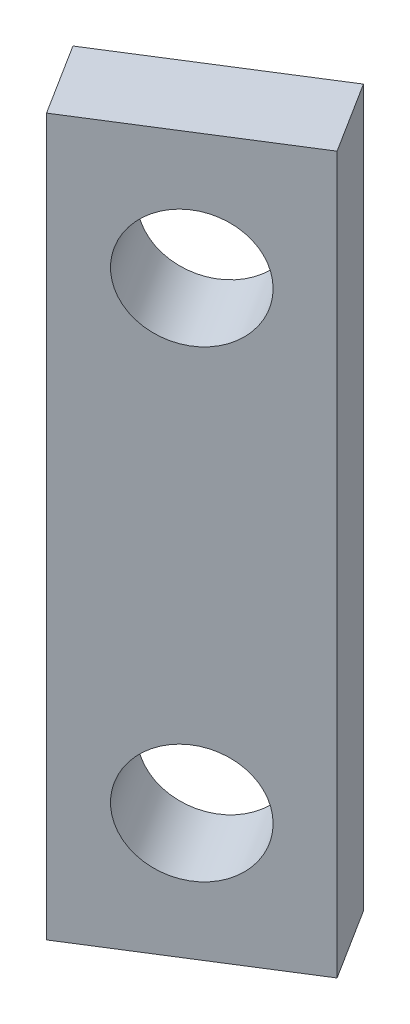
ISO-10303-21;
HEADER;
FILE_DESCRIPTION(('STEP AP214'),'2;1');
FILE_NAME('part.step','',(''),(''),'','','');
FILE_SCHEMA(('AUTOMOTIVE_DESIGN { 1 0 10303 214 1 1 1 1 }'));
ENDSEC;
DATA;
#1=APPLICATION_CONTEXT('core data for automotive mechanical design processes');
#2=APPLICATION_PROTOCOL_DEFINITION('international standard','automotive_design',2000,#1);
#3=PRODUCT_CONTEXT('',#1,'mechanical');
#4=PRODUCT('Part','Part','',(#3));
#5=PRODUCT_RELATED_PRODUCT_CATEGORY('part','',(#4));
#6=PRODUCT_DEFINITION_FORMATION('','',#4);
#7=PRODUCT_DEFINITION_CONTEXT('part definition',#1,'design');
#8=PRODUCT_DEFINITION('design','',#6,#7);
#9=PRODUCT_DEFINITION_SHAPE('','',#8);
#10=(LENGTH_UNIT() NAMED_UNIT(*) SI_UNIT(.MILLI.,.METRE.));
#11=(NAMED_UNIT(*) PLANE_ANGLE_UNIT() SI_UNIT($,.RADIAN.));
#12=(NAMED_UNIT(*) SI_UNIT($,.STERADIAN.) SOLID_ANGLE_UNIT());
#13=UNCERTAINTY_MEASURE_WITH_UNIT(LENGTH_MEASURE(1.E-05),#10,'distance_accuracy_value','');
#14=(GEOMETRIC_REPRESENTATION_CONTEXT(3) GLOBAL_UNCERTAINTY_ASSIGNED_CONTEXT((#13)) GLOBAL_UNIT_ASSIGNED_CONTEXT((#10,
#11,#12)) REPRESENTATION_CONTEXT('',''));
#15=CARTESIAN_POINT('',(0.,0.,0.));
#16=DIRECTION('',(0.,0.,1.));
#17=DIRECTION('',(1.,0.,0.));
#18=AXIS2_PLACEMENT_3D('',#15,#16,#17);
#19=CARTESIAN_POINT('',(7.11526294979669,0.,11.295819277735));
#20=DIRECTION('',(-0.532978498112112,0.,-0.846128784849067));
#21=DIRECTION('',(-0.846128784849067,0.,0.532978498112112));
#22=AXIS2_PLACEMENT_3D('',#19,#20,#21);
#23=PLANE('',#22);
#24=DIRECTION('',(0.,1.,0.));
#25=VECTOR('',#24,1.);
#26=CARTESIAN_POINT('',(13.0680903164457,4.25,7.54611941382692));
#27=LINE('',#26,#25);
#28=CARTESIAN_POINT('',(13.0680903164457,-4.25,7.54611941382692));
#29=VERTEX_POINT('',#28);
#30=CARTESIAN_POINT('',(13.0680903164457,4.25,7.54611941382692));
#31=VERTEX_POINT('',#30);
#32=EDGE_CURVE('E84',#29,#31,#27,.T.);
#33=ORIENTED_EDGE('',*,*,#32,.T.);
#34=DIRECTION('',(-0.846128784849067,0.,0.532978498112112));
#35=VECTOR('',#34,1.);
#36=CARTESIAN_POINT('',(13.0680903164457,4.25,7.54611941382692));
#37=LINE('',#36,#35);
#38=CARTESIAN_POINT('',(10.9521698666784,4.25,8.87894264787263));
#39=VERTEX_POINT('',#38);
#40=EDGE_CURVE('E79',#31,#39,#37,.T.);
#41=ORIENTED_EDGE('',*,*,#40,.T.);
#42=DIRECTION('',(0.,-1.,0.));
#43=VECTOR('',#42,1.);
#44=CARTESIAN_POINT('',(10.9521698666784,4.25,8.87894264787263));
#45=LINE('',#44,#43);
#46=CARTESIAN_POINT('',(10.9521698666784,-4.25,8.87894264787263));
#47=VERTEX_POINT('',#46);
#48=EDGE_CURVE('E82',#39,#47,#45,.T.);
#49=ORIENTED_EDGE('',*,*,#48,.T.);
#50=DIRECTION('',(0.846128784849067,0.,-0.532978498112112));
#51=VECTOR('',#50,1.);
#52=CARTESIAN_POINT('',(13.0680903164457,-4.25,7.54611941382692));
#53=LINE('',#52,#51);
#54=EDGE_CURVE('E49',#47,#29,#53,.T.);
#55=ORIENTED_EDGE('',*,*,#54,.T.);
#56=EDGE_LOOP('',(#33,#41,#49,#55));
#57=FACE_BOUND('',#56,.T.);
#58=CARTESIAN_POINT('',(12.0101300915621,2.75,8.21253103084977));
#59=DIRECTION('',(0.532978498112111,0.,0.846128784849067));
#60=DIRECTION('',(0.846128784849067,0.,-0.532978498112111));
#61=AXIS2_PLACEMENT_3D('',#58,#59,#60);
#62=CIRCLE('',#61,0.700000000000001);
#63=CARTESIAN_POINT('',(12.6024202409564,2.75,7.83944608217129));
#64=VERTEX_POINT('',#63);
#65=EDGE_CURVE('E99',#64,#64,#62,.T.);
#66=ORIENTED_EDGE('',*,*,#65,.F.);
#67=EDGE_LOOP('',(#66));
#68=FACE_BOUND('',#67,.T.);
#69=CARTESIAN_POINT('',(12.0101300915621,-2.75,8.21253103084977));
#70=DIRECTION('',(0.532978498112111,0.,0.846128784849067));
#71=DIRECTION('',(0.846128784849067,0.,-0.532978498112111));
#72=AXIS2_PLACEMENT_3D('',#69,#70,#71);
#73=CIRCLE('',#72,0.700000000000001);
#74=CARTESIAN_POINT('',(12.6024202409564,-2.75,7.83944608217129));
#75=VERTEX_POINT('',#74);
#76=EDGE_CURVE('E114',#75,#75,#73,.T.);
#77=ORIENTED_EDGE('',*,*,#76,.F.);
#78=EDGE_LOOP('',(#77));
#79=FACE_BOUND('',#78,.T.);
#80=ADVANCED_FACE('F32',(#57,#68,#79),#23,.F.);
#81=CARTESIAN_POINT('',(6.58228445168458,0.,10.449690492886));
#82=DIRECTION('',(-0.532978498112112,0.,-0.846128784849067));
#83=DIRECTION('',(-0.846128784849067,0.,0.532978498112112));
#84=AXIS2_PLACEMENT_3D('',#81,#82,#83);
#85=PLANE('',#84);
#86=CARTESIAN_POINT('',(11.47715159345,2.75,7.36640224600071));
#87=DIRECTION('',(0.532978498112111,0.,0.846128784849067));
#88=DIRECTION('',(0.846128784849067,0.,-0.532978498112111));
#89=AXIS2_PLACEMENT_3D('',#86,#87,#88);
#90=CIRCLE('',#89,0.700000000000001);
#91=CARTESIAN_POINT('',(12.0694417428443,2.75,6.99331729732223));
#92=VERTEX_POINT('',#91);
#93=EDGE_CURVE('E111',#92,#92,#90,.T.);
#94=ORIENTED_EDGE('',*,*,#93,.T.);
#95=EDGE_LOOP('',(#94));
#96=FACE_BOUND('',#95,.T.);
#97=DIRECTION('',(0.,1.,0.));
#98=VECTOR('',#97,1.);
#99=CARTESIAN_POINT('',(12.5351118183336,4.25,6.69999062897785));
#100=LINE('',#99,#98);
#101=CARTESIAN_POINT('',(12.5351118183336,-4.25,6.69999062897785));
#102=VERTEX_POINT('',#101);
#103=CARTESIAN_POINT('',(12.5351118183336,4.25,6.69999062897785));
#104=VERTEX_POINT('',#103);
#105=EDGE_CURVE('E96',#102,#104,#100,.T.);
#106=ORIENTED_EDGE('',*,*,#105,.F.);
#107=DIRECTION('',(0.846128784849067,0.,-0.532978498112112));
#108=VECTOR('',#107,1.);
#109=CARTESIAN_POINT('',(12.5351118183336,-4.25,6.69999062897785));
#110=LINE('',#109,#108);
#111=CARTESIAN_POINT('',(10.4191913685663,-4.25,8.03281386302356));
#112=VERTEX_POINT('',#111);
#113=EDGE_CURVE('E72',#112,#102,#110,.T.);
#114=ORIENTED_EDGE('',*,*,#113,.F.);
#115=DIRECTION('',(0.,-1.,0.));
#116=VECTOR('',#115,1.);
#117=CARTESIAN_POINT('',(10.4191913685663,4.25,8.03281386302356));
#118=LINE('',#117,#116);
#119=CARTESIAN_POINT('',(10.4191913685663,4.25,8.03281386302356));
#120=VERTEX_POINT('',#119);
#121=EDGE_CURVE('E66',#120,#112,#118,.T.);
#122=ORIENTED_EDGE('',*,*,#121,.F.);
#123=DIRECTION('',(-0.846128784849067,0.,0.532978498112112));
#124=VECTOR('',#123,1.);
#125=CARTESIAN_POINT('',(12.5351118183336,4.25,6.69999062897785));
#126=LINE('',#125,#124);
#127=EDGE_CURVE('E88',#104,#120,#126,.T.);
#128=ORIENTED_EDGE('',*,*,#127,.F.);
#129=EDGE_LOOP('',(#106,#114,#122,#128));
#130=FACE_BOUND('',#129,.T.);
#131=CARTESIAN_POINT('',(11.47715159345,-2.75,7.36640224600071));
#132=DIRECTION('',(0.532978498112111,0.,0.846128784849067));
#133=DIRECTION('',(0.846128784849067,0.,-0.532978498112111));
#134=AXIS2_PLACEMENT_3D('',#131,#132,#133);
#135=CIRCLE('',#134,0.700000000000001);
#136=CARTESIAN_POINT('',(12.0694417428443,-2.75,6.99331729732223));
#137=VERTEX_POINT('',#136);
#138=EDGE_CURVE('E117',#137,#137,#135,.T.);
#139=ORIENTED_EDGE('',*,*,#138,.T.);
#140=EDGE_LOOP('',(#139));
#141=FACE_BOUND('',#140,.T.);
#142=ADVANCED_FACE('F107',(#96,#130,#141),#85,.T.);
#143=CARTESIAN_POINT('',(13.0680903164457,4.25,7.54611941382692));
#144=DIRECTION('',(-0.846128784849067,0.,0.532978498112111));
#145=DIRECTION('',(0.532978498112111,0.,0.846128784849067));
#146=AXIS2_PLACEMENT_3D('',#143,#144,#145);
#147=PLANE('',#146);
#148=ORIENTED_EDGE('',*,*,#105,.T.);
#149=DIRECTION('',(-0.532978498112111,0.,-0.846128784849067));
#150=VECTOR('',#149,1.);
#151=CARTESIAN_POINT('',(13.0680903164457,4.25,7.54611941382692));
#152=LINE('',#151,#150);
#153=EDGE_CURVE('E11',#31,#104,#152,.T.);
#154=ORIENTED_EDGE('',*,*,#153,.F.);
#155=ORIENTED_EDGE('',*,*,#32,.F.);
#156=DIRECTION('',(-0.532978498112111,0.,-0.846128784849067));
#157=VECTOR('',#156,1.);
#158=CARTESIAN_POINT('',(13.0680903164457,-4.25,7.54611941382692));
#159=LINE('',#158,#157);
#160=EDGE_CURVE('E92',#29,#102,#159,.T.);
#161=ORIENTED_EDGE('',*,*,#160,.T.);
#162=EDGE_LOOP('',(#148,#154,#155,#161));
#163=FACE_BOUND('',#162,.T.);
#164=ADVANCED_FACE('F34',(#163),#147,.F.);
#165=CARTESIAN_POINT('',(13.0680903164457,4.25,7.54611941382692));
#166=DIRECTION('',(0.,-1.,0.));
#167=DIRECTION('',(0.,0.,-1.));
#168=AXIS2_PLACEMENT_3D('',#165,#166,#167);
#169=PLANE('',#168);
#170=ORIENTED_EDGE('',*,*,#127,.T.);
#171=DIRECTION('',(-0.532978498112111,0.,-0.846128784849067));
#172=VECTOR('',#171,1.);
#173=CARTESIAN_POINT('',(10.9521698666784,4.25,8.87894264787263));
#174=LINE('',#173,#172);
#175=EDGE_CURVE('E41',#39,#120,#174,.T.);
#176=ORIENTED_EDGE('',*,*,#175,.F.);
#177=ORIENTED_EDGE('',*,*,#40,.F.);
#178=ORIENTED_EDGE('',*,*,#153,.T.);
#179=EDGE_LOOP('',(#170,#176,#177,#178));
#180=FACE_BOUND('',#179,.T.);
#181=ADVANCED_FACE('F87',(#180),#169,.F.);
#182=CARTESIAN_POINT('',(10.9521698666784,4.25,8.87894264787263));
#183=DIRECTION('',(0.846128784849067,0.,-0.532978498112111));
#184=DIRECTION('',(-0.532978498112111,0.,-0.846128784849067));
#185=AXIS2_PLACEMENT_3D('',#182,#183,#184);
#186=PLANE('',#185);
#187=ORIENTED_EDGE('',*,*,#121,.T.);
#188=DIRECTION('',(-0.532978498112111,0.,-0.846128784849067));
#189=VECTOR('',#188,1.);
#190=CARTESIAN_POINT('',(10.9521698666784,-4.25,8.87894264787263));
#191=LINE('',#190,#189);
#192=EDGE_CURVE('E89',#47,#112,#191,.T.);
#193=ORIENTED_EDGE('',*,*,#192,.F.);
#194=ORIENTED_EDGE('',*,*,#48,.F.);
#195=ORIENTED_EDGE('',*,*,#175,.T.);
#196=EDGE_LOOP('',(#187,#193,#194,#195));
#197=FACE_BOUND('',#196,.T.);
#198=ADVANCED_FACE('F90',(#197),#186,.F.);
#199=CARTESIAN_POINT('',(13.0680903164457,-4.25,7.54611941382692));
#200=DIRECTION('',(0.,1.,0.));
#201=DIRECTION('',(0.,0.,1.));
#202=AXIS2_PLACEMENT_3D('',#199,#200,#201);
#203=PLANE('',#202);
#204=ORIENTED_EDGE('',*,*,#113,.T.);
#205=ORIENTED_EDGE('',*,*,#160,.F.);
#206=ORIENTED_EDGE('',*,*,#54,.F.);
#207=ORIENTED_EDGE('',*,*,#192,.T.);
#208=EDGE_LOOP('',(#204,#205,#206,#207));
#209=FACE_BOUND('',#208,.T.);
#210=ADVANCED_FACE('F104',(#209),#203,.F.);
#211=CARTESIAN_POINT('',(12.0101300915621,2.75,8.21253103084977));
#212=DIRECTION('',(-0.532978498112111,0.,-0.846128784849067));
#213=DIRECTION('',(-0.846128784849067,0.,0.532978498112111));
#214=AXIS2_PLACEMENT_3D('',#211,#212,#213);
#215=CYLINDRICAL_SURFACE('',#214,0.700000000000001);
#216=ORIENTED_EDGE('',*,*,#65,.T.);
#217=EDGE_LOOP('',(#216));
#218=FACE_BOUND('',#217,.T.);
#219=ORIENTED_EDGE('',*,*,#93,.F.);
#220=EDGE_LOOP('',(#219));
#221=FACE_BOUND('',#220,.T.);
#222=ADVANCED_FACE('F134',(#218,#221),#215,.F.);
#223=CARTESIAN_POINT('',(12.0101300915621,-2.75,8.21253103084977));
#224=DIRECTION('',(-0.532978498112111,0.,-0.846128784849067));
#225=DIRECTION('',(-0.846128784849067,0.,0.532978498112111));
#226=AXIS2_PLACEMENT_3D('',#223,#224,#225);
#227=CYLINDRICAL_SURFACE('',#226,0.700000000000001);
#228=ORIENTED_EDGE('',*,*,#76,.T.);
#229=EDGE_LOOP('',(#228));
#230=FACE_BOUND('',#229,.T.);
#231=ORIENTED_EDGE('',*,*,#138,.F.);
#232=EDGE_LOOP('',(#231));
#233=FACE_BOUND('',#232,.T.);
#234=ADVANCED_FACE('F123',(#230,#233),#227,.F.);
#235=CLOSED_SHELL('',(#80,#142,#164,#181,#198,#210,#222,#234));
#236=MANIFOLD_SOLID_BREP('B2',#235);
#237=ADVANCED_BREP_SHAPE_REPRESENTATION('',(#18,#236),#14);
#238=SHAPE_DEFINITION_REPRESENTATION(#9,#237);
ENDSEC;
END-ISO-10303-21;
